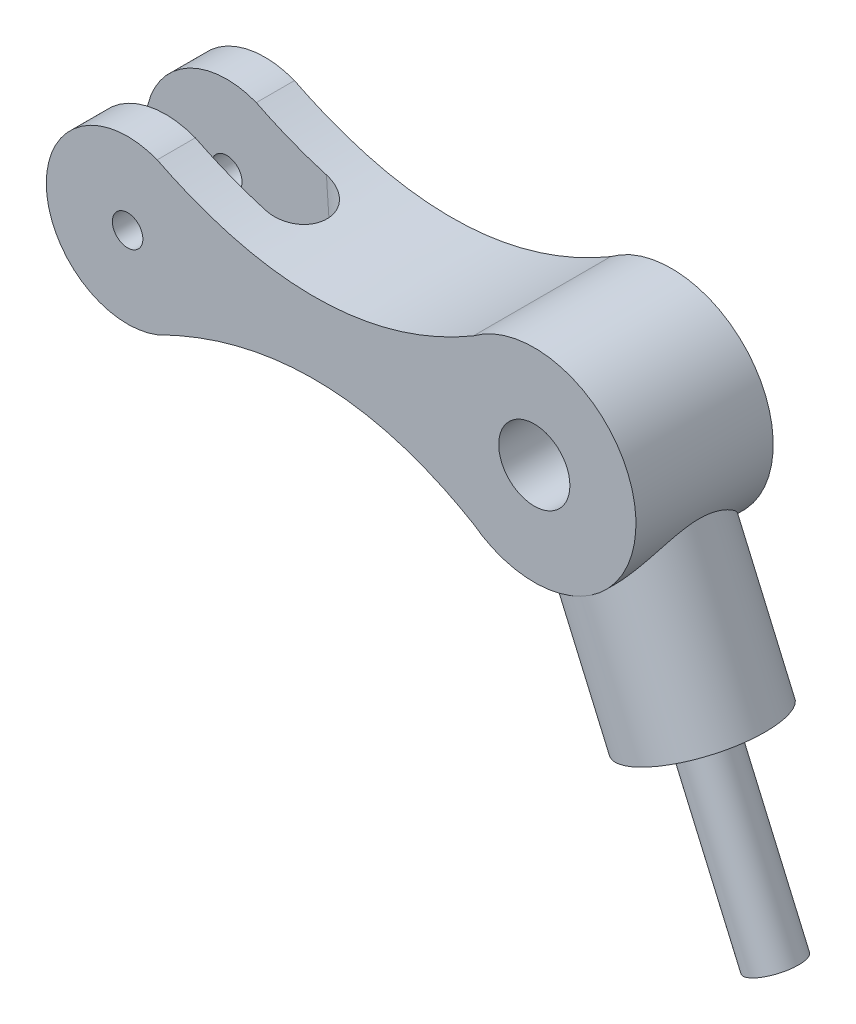
ISO-10303-21;
HEADER;
FILE_DESCRIPTION(('STEP AP214'),'2;1');
FILE_NAME('part.step','',(''),(''),'','','');
FILE_SCHEMA(('AUTOMOTIVE_DESIGN { 1 0 10303 214 1 1 1 1 }'));
ENDSEC;
DATA;
#1=APPLICATION_CONTEXT('core data for automotive mechanical design processes');
#2=APPLICATION_PROTOCOL_DEFINITION('international standard','automotive_design',2000,#1);
#3=PRODUCT_CONTEXT('',#1,'mechanical');
#4=PRODUCT('Part','Part','',(#3));
#5=PRODUCT_RELATED_PRODUCT_CATEGORY('part','',(#4));
#6=PRODUCT_DEFINITION_FORMATION('','',#4);
#7=PRODUCT_DEFINITION_CONTEXT('part definition',#1,'design');
#8=PRODUCT_DEFINITION('design','',#6,#7);
#9=PRODUCT_DEFINITION_SHAPE('','',#8);
#10=(LENGTH_UNIT() NAMED_UNIT(*) SI_UNIT(.MILLI.,.METRE.));
#11=(NAMED_UNIT(*) PLANE_ANGLE_UNIT() SI_UNIT($,.RADIAN.));
#12=(NAMED_UNIT(*) SI_UNIT($,.STERADIAN.) SOLID_ANGLE_UNIT());
#13=UNCERTAINTY_MEASURE_WITH_UNIT(LENGTH_MEASURE(1.E-05),#10,'distance_accuracy_value','');
#14=(GEOMETRIC_REPRESENTATION_CONTEXT(3) GLOBAL_UNCERTAINTY_ASSIGNED_CONTEXT((#13)) GLOBAL_UNIT_ASSIGNED_CONTEXT((#10,
#11,#12)) REPRESENTATION_CONTEXT('',''));
#15=CARTESIAN_POINT('',(0.,0.,0.));
#16=DIRECTION('',(0.,0.,1.));
#17=DIRECTION('',(1.,0.,0.));
#18=AXIS2_PLACEMENT_3D('',#15,#16,#17);
#19=CARTESIAN_POINT('',(55.942252811818,0.,13.5));
#20=DIRECTION('',(0.,0.,-1.));
#21=DIRECTION('',(-1.,0.,0.));
#22=AXIS2_PLACEMENT_3D('',#19,#20,#21);
#23=CYLINDRICAL_SURFACE('',#22,9.99999999999999);
#24=CARTESIAN_POINT('',(55.942252811818,0.,0.));
#25=DIRECTION('',(0.,0.,1.));
#26=DIRECTION('',(1.,0.,0.));
#27=AXIS2_PLACEMENT_3D('',#24,#25,#26);
#28=CIRCLE('',#27,9.99999999999999);
#29=CARTESIAN_POINT('',(49.9480196172884,-8.00432185819632,0.));
#30=VERTEX_POINT('',#29);
#31=CARTESIAN_POINT('',(60.5223949359773,-8.88944869620729,0.));
#32=VERTEX_POINT('',#31);
#33=EDGE_CURVE('E132',#30,#32,#28,.T.);
#34=ORIENTED_EDGE('',*,*,#33,.T.);
#35=CARTESIAN_POINT('',(65.4131906419706,-3.20956953770831,6.75));
#36=CARTESIAN_POINT('',(65.4131903282532,-3.20957446500106,6.59271011902694));
#37=CARTESIAN_POINT('',(65.4105628783188,-3.21735624223265,6.43534763654979));
#38=CARTESIAN_POINT('',(65.400051791324,-3.24812102991703,6.12221197366537));
#39=CARTESIAN_POINT('',(65.3921635656996,-3.27111731065455,5.96644030132915));
#40=CARTESIAN_POINT('',(65.371099119873,-3.33134675678611,5.657548712348));
#41=CARTESIAN_POINT('',(65.3579063469569,-3.36862446970872,5.50443867621186));
#42=CARTESIAN_POINT('',(65.3262162087858,-3.45591970728791,5.20239714961083));
#43=CARTESIAN_POINT('',(65.3077155761127,-3.50594507703394,5.05346829518884));
#44=CARTESIAN_POINT('',(65.265671405489,-3.61625364047853,4.762635548889));
#45=CARTESIAN_POINT('',(65.2422017006928,-3.67638424489065,4.62066270048013));
#46=CARTESIAN_POINT('',(65.1900183206903,-3.80574717731307,4.34201002160424));
#47=CARTESIAN_POINT('',(65.1613054749022,-3.87497806525494,4.20532935809975));
#48=CARTESIAN_POINT('',(65.0671620716154,-4.09403928196318,3.80358998121851));
#49=CARTESIAN_POINT('',(64.9936852813529,-4.25535379517104,3.54654400060154));
#50=CARTESIAN_POINT('',(64.8583635266996,-4.52947407140592,3.15390870789333));
#51=CARTESIAN_POINT('',(64.8037151243891,-4.63571399736818,3.011030623364));
#52=CARTESIAN_POINT('',(64.6860696717777,-4.85397225998646,2.73332059701513));
#53=CARTESIAN_POINT('',(64.6230713162144,-4.96599149838751,2.5984899179527));
#54=CARTESIAN_POINT('',(64.4208610531046,-5.30880848609888,2.20597845732678));
#55=CARTESIAN_POINT('',(64.2685072885842,-5.54621048707119,1.960494421241));
#56=CARTESIAN_POINT('',(63.9930083059543,-5.93448952995415,1.59373503558975));
#57=CARTESIAN_POINT('',(63.8814548919859,-6.08321112766533,1.46121450784275));
#58=CARTESIAN_POINT('',(63.6438573678277,-6.3813453324139,1.21047666661028));
#59=CARTESIAN_POINT('',(63.5178101050509,-6.5307580829765,1.0922624764461));
#60=CARTESIAN_POINT('',(63.2511951682608,-6.82782231323339,0.871654942528912));
#61=CARTESIAN_POINT('',(63.1106486814312,-6.97547602080363,0.769239044807763));
#62=CARTESIAN_POINT('',(62.8149543287501,-7.26698107861642,0.581554196208829));
#63=CARTESIAN_POINT('',(62.6598129159896,-7.41083407362825,0.496277719026028));
#64=CARTESIAN_POINT('',(62.3793167894563,-7.65433148239627,0.365009965339137));
#65=CARTESIAN_POINT('',(62.2572453883692,-7.75541546037791,0.31463033913639));
#66=CARTESIAN_POINT('',(62.0060059810937,-7.95339269838064,0.224485914566862));
#67=CARTESIAN_POINT('',(61.87683957148,-8.05028689252018,0.184718739806516));
#68=CARTESIAN_POINT('',(61.6120635924844,-8.23891068581037,0.116401722474417));
#69=CARTESIAN_POINT('',(61.4764584766241,-8.33064376154492,0.087844249514283));
#70=CARTESIAN_POINT('',(61.1994904542031,-8.50814334879939,0.0424012355333629));
#71=CARTESIAN_POINT('',(61.0581273797146,-8.5939096861047,0.0255160351867107));
#72=CARTESIAN_POINT('',(60.7701187225453,-8.75895824966189,0.00374437110009561));
#73=CARTESIAN_POINT('',(60.6234568302598,-8.83821746589292,-0.00110114873540141));
#74=CARTESIAN_POINT('',(60.3264351662197,-8.98925487067423,0.00152042063544576));
#75=CARTESIAN_POINT('',(60.1760754009931,-9.06103307242975,0.00898748810761847));
#76=CARTESIAN_POINT('',(59.8728785127879,-9.19661694420549,0.0362413508052443));
#77=CARTESIAN_POINT('',(59.7200410960682,-9.26042166099339,0.0560296173448663));
#78=CARTESIAN_POINT('',(59.4132002172768,-9.37974547614999,0.107743077669081));
#79=CARTESIAN_POINT('',(59.2591967802264,-9.43526475178771,0.139668011734875));
#80=CARTESIAN_POINT('',(58.9590806963103,-9.53532832630506,0.213395830223299));
#81=CARTESIAN_POINT('',(58.8129625013851,-9.58028540615935,0.254618137607315));
#82=CARTESIAN_POINT('',(58.5218466823896,-9.66274427033494,0.347279897009575));
#83=CARTESIAN_POINT('',(58.376849460399,-9.70024348893043,0.39872285310961));
#84=CARTESIAN_POINT('',(57.9451230491196,-9.8018201801972,0.567657565933605));
#85=CARTESIAN_POINT('',(57.6614197799755,-9.85505487699275,0.699814591645193));
#86=CARTESIAN_POINT('',(57.087109825858,-9.93883054094655,1.01091785849912));
#87=CARTESIAN_POINT('',(56.7977859841207,-9.96719960801004,1.19277428678029));
#88=CARTESIAN_POINT('',(56.2433433476607,-9.99932792491496,1.59225753438061));
#89=CARTESIAN_POINT('',(55.9782456773066,-10.0030658954592,1.80991511671498));
#90=CARTESIAN_POINT('',(55.4400245625894,-9.99153481126897,2.31260268901462));
#91=CARTESIAN_POINT('',(55.1718178829724,-9.97328703459612,2.60284471518994));
#92=CARTESIAN_POINT('',(54.6843041563913,-9.9235886003921,3.22095601133613));
#93=CARTESIAN_POINT('',(54.4649953071923,-9.89213842958678,3.5488238938502));
#94=CARTESIAN_POINT('',(54.1137382301529,-9.83278468747012,4.18788958321196));
#95=CARTESIAN_POINT('',(53.9737338231451,-9.80502806567744,4.49461159860274));
#96=CARTESIAN_POINT('',(53.8027906432307,-9.76862644736196,4.96883698024534));
#97=CARTESIAN_POINT('',(53.7523250508992,-9.75736616138665,5.12924267210825));
#98=CARTESIAN_POINT('',(53.6653200171419,-9.73743203665615,5.45391608240082));
#99=CARTESIAN_POINT('',(53.628774181792,-9.72875701078271,5.61818199076857));
#100=CARTESIAN_POINT('',(53.5702044468012,-9.7146438463433,5.95065055475984));
#101=CARTESIAN_POINT('',(53.5482868028933,-9.70922941912707,6.11887301884675));
#102=CARTESIAN_POINT('',(53.5199455098569,-9.7021979218121,6.45670678679136));
#103=CARTESIAN_POINT('',(53.5135217182146,-9.70058081678525,6.62631807786012));
#104=CARTESIAN_POINT('',(53.5163402265153,-9.7012859684183,6.96540758311274));
#105=CARTESIAN_POINT('',(53.5255832248931,-9.70360840070509,7.13488579102669));
#106=CARTESIAN_POINT('',(53.5594912501235,-9.71198998490728,7.47218481451308));
#107=CARTESIAN_POINT('',(53.5841557362555,-9.71804900580734,7.64000568798673));
#108=CARTESIAN_POINT('',(53.6449648355328,-9.73259119001785,7.95537394198968));
#109=CARTESIAN_POINT('',(53.6796543796358,-9.74075795806132,8.10321956288398));
#110=CARTESIAN_POINT('',(53.7603044323051,-9.75913957093228,8.3956921149014));
#111=CARTESIAN_POINT('',(53.8062686371497,-9.76935508721952,8.54031797346459));
#112=CARTESIAN_POINT('',(53.9600191120591,-9.80213092925187,8.96829496765182));
#113=CARTESIAN_POINT('',(54.0836923889043,-9.82682837856401,9.24589132876214));
#114=CARTESIAN_POINT('',(54.3848623567957,-9.87930205283791,9.81476421611703));
#115=CARTESIAN_POINT('',(54.5671271591126,-9.90708087436036,10.1034792046455));
#116=CARTESIAN_POINT('',(54.9703114317889,-9.95472358232926,10.6536664325884));
#117=CARTESIAN_POINT('',(55.1912681911116,-9.97457977234444,10.9151119999796));
#118=CARTESIAN_POINT('',(55.5694573424656,-9.99405169857428,11.3078184203211));
#119=CARTESIAN_POINT('',(55.7163344001963,-9.99860505432489,11.4489761570243));
#120=CARTESIAN_POINT('',(56.020370960258,-10.0008488156741,11.7197883951065));
#121=CARTESIAN_POINT('',(56.17752751542,-9.99854117998202,11.8494461686675));
#122=CARTESIAN_POINT('',(56.5008823050573,-9.98569551144501,12.0964075452126));
#123=CARTESIAN_POINT('',(56.667077961825,-9.97515981369016,12.2137146425509));
#124=CARTESIAN_POINT('',(57.0072482062699,-9.94459275573545,12.435049467855));
#125=CARTESIAN_POINT('',(57.1812210624003,-9.92456349977689,12.5390801320518));
#126=CARTESIAN_POINT('',(57.5060785120168,-9.87809348362382,12.7167275105692));
#127=CARTESIAN_POINT('',(57.6560041102109,-9.85326807413119,12.7925265506432));
#128=CARTESIAN_POINT('',(57.9592742879499,-9.79568442999783,12.9335052189485));
#129=CARTESIAN_POINT('',(58.1126182282058,-9.76292766754252,12.9986868141952));
#130=CARTESIAN_POINT('',(58.4215615293487,-9.68907815375326,13.1177682458821));
#131=CARTESIAN_POINT('',(58.5771594548792,-9.64799050810199,13.1716749513636));
#132=CARTESIAN_POINT('',(58.8894999705264,-9.55720563599993,13.267674405186));
#133=CARTESIAN_POINT('',(59.0462425733419,-9.50750831389524,13.3097670222583));
#134=CARTESIAN_POINT('',(59.3602439571733,-9.39920386801146,13.3818100156563));
#135=CARTESIAN_POINT('',(59.5175020465129,-9.34055921809179,13.4117072061178));
#136=CARTESIAN_POINT('',(59.8304810583036,-9.21466926037093,13.4587604710289));
#137=CARTESIAN_POINT('',(59.9862019781517,-9.14742393800865,13.4759165239073));
#138=CARTESIAN_POINT('',(60.2947239999563,-9.00471437240156,13.4973393569974));
#139=CARTESIAN_POINT('',(60.447525305899,-8.92925070583841,13.5016070409836));
#140=CARTESIAN_POINT('',(60.7489188221551,-8.77068718360534,13.4973154683948));
#141=CARTESIAN_POINT('',(60.8975112140828,-8.68758765808071,13.4887567661388));
#142=CARTESIAN_POINT('',(61.1789996090638,-8.52064213006124,13.4601302629508));
#143=CARTESIAN_POINT('',(61.31226242162,-8.43726471644197,13.4409193844447));
#144=CARTESIAN_POINT('',(61.5734171425013,-8.26525521122198,13.3919936833037));
#145=CARTESIAN_POINT('',(61.7013072103708,-8.1766213436753,13.362275293579));
#146=CARTESIAN_POINT('',(61.9510005013606,-7.99492261532203,13.2927951068871));
#147=CARTESIAN_POINT('',(62.0728053606516,-7.90185895886767,13.2530360272261));
#148=CARTESIAN_POINT('',(62.3099405927337,-7.71204473844573,13.1639729215775));
#149=CARTESIAN_POINT('',(62.425268430233,-7.61529275529735,13.1146651911062));
#150=CARTESIAN_POINT('',(62.6560414475452,-7.41282893627145,13.0037150661454));
#151=CARTESIAN_POINT('',(62.7710492888631,-7.30693378175519,12.9414968949251));
#152=CARTESIAN_POINT('',(62.9931537438004,-7.09285787866868,12.8075776618063));
#153=CARTESIAN_POINT('',(63.1002476208352,-6.98467635596636,12.7358733433686));
#154=CARTESIAN_POINT('',(63.4095449906225,-6.65802313648727,12.507434101812));
#155=CARTESIAN_POINT('',(63.5998536018982,-6.43736317744097,12.3373290848344));
#156=CARTESIAN_POINT('',(63.8765621124356,-6.08883489708679,12.0430708579551));
#157=CARTESIAN_POINT('',(63.9733702075149,-5.96035745904392,11.9290345509014));
#158=CARTESIAN_POINT('',(64.1565418940759,-5.70526590110043,11.6909053200788));
#159=CARTESIAN_POINT('',(64.2429069921066,-5.57865151474875,11.5668138512326));
#160=CARTESIAN_POINT('',(64.4056301207998,-5.32855932499476,11.3089152977654));
#161=CARTESIAN_POINT('',(64.4819750407249,-5.20508579808834,11.1750958333294));
#162=CARTESIAN_POINT('',(64.6249010105613,-4.96299941316684,10.8982462105959));
#163=CARTESIAN_POINT('',(64.691485263455,-4.84438496988165,10.7552190960799));
#164=CARTESIAN_POINT('',(64.8126813098777,-4.61857325889817,10.4663461379211));
#165=CARTESIAN_POINT('',(64.8676799225338,-4.51110538499484,10.3208743217992));
#166=CARTESIAN_POINT('',(64.9694120064075,-4.30391843550718,10.0216979365494));
#167=CARTESIAN_POINT('',(65.0161445864332,-4.20420019608891,9.86799248204678));
#168=CARTESIAN_POINT('',(65.1015458291601,-4.01473966015517,9.55268390873715));
#169=CARTESIAN_POINT('',(65.1402255722733,-3.92498373637029,9.39109202464197));
#170=CARTESIAN_POINT('',(65.209818560403,-3.75771680281769,9.06000117876033));
#171=CARTESIAN_POINT('',(65.2407315462874,-3.68020620163792,8.89050195337504));
#172=CARTESIAN_POINT('',(65.2878619932331,-3.55846522152859,8.58932803844416));
#173=CARTESIAN_POINT('',(65.3058099811929,-3.5108247009712,8.45929853008749));
#174=CARTESIAN_POINT('',(65.3375604305756,-3.42495152554431,8.19568768579335));
#175=CARTESIAN_POINT('',(65.3513641455263,-3.38671602655009,8.06210743719051));
#176=CARTESIAN_POINT('',(65.3748109924465,-3.32085357059488,7.79239128257619));
#177=CARTESIAN_POINT('',(65.3844658291592,-3.29319679370914,7.65626371205498));
#178=CARTESIAN_POINT('',(65.3996678899122,-3.24928422408865,7.38200548128885));
#179=CARTESIAN_POINT('',(65.4052177924522,-3.23302099734557,7.24387618729153));
#180=CARTESIAN_POINT('',(65.4102074005869,-3.21836165323251,7.04619622527894));
#181=CARTESIAN_POINT('',(65.4113259112392,-3.21506781425389,6.9870171989215));
#182=CARTESIAN_POINT('',(65.4128176375095,-3.21067069134667,6.86856222734911));
#183=CARTESIAN_POINT('',(65.4131907602181,-3.2095676804953,6.80928627097371));
#184=CARTESIAN_POINT('',(65.4131906419706,-3.20956953770831,6.75));
#185=B_SPLINE_CURVE_WITH_KNOTS('',3,(#35,#36,#37,#38,#39,#40,#41,#42,#43,#44,#45,#46,#47,#48,
#49,#50,#51,#52,#53,#54,#55,#56,#57,#58,#59,#60,#61,#62,#63,#64,#65,#66,#67,#68,#69,#70,#71,#72,
#73,#74,#75,#76,#77,#78,#79,#80,#81,#82,#83,#84,#85,#86,#87,#88,#89,#90,#91,#92,#93,#94,#95,#96,
#97,#98,#99,#100,#101,#102,#103,#104,#105,#106,#107,#108,#109,#110,#111,#112,#113,#114,#115,
#116,#117,#118,#119,#120,#121,#122,#123,#124,#125,#126,#127,#128,#129,#130,#131,#132,#133,#134,
#135,#136,#137,#138,#139,#140,#141,#142,#143,#144,#145,#146,#147,#148,#149,#150,#151,#152,#153,
#154,#155,#156,#157,#158,#159,#160,#161,#162,#163,#164,#165,#166,#167,#168,#169,#170,#171,#172,
#173,#174,#175,#176,#177,#178,#179,#180,#181,#182,#183,#184),.UNSPECIFIED.,.T.,.F.,(4,2,2,2,2,2,
2,2,2,2,2,2,2,2,2,2,2,2,2,2,2,2,2,2,2,2,2,2,2,2,2,2,2,2,2,2,2,2,2,2,2,2,2,2,2,2,2,2,2,2,2,2,2,2,
2,2,2,2,2,2,2,2,2,2,2,2,2,2,2,2,2,2,2,2,4),(0.,0.471786685103131,0.943985412040329,
1.41766920340758,1.89164521352252,2.35901911894529,2.82631915392471,3.75998313218948,
4.31834542677098,4.8767951075606,5.99451563681231,6.67870157332916,7.3630366110549,
8.04638545134887,8.7294335590151,9.22785753243807,9.72616980242539,10.2241422830605,
10.7221292972134,11.2218075353302,11.7214848914163,12.2212219270353,12.720948269126,
13.1954260749439,13.6700668339223,14.6185809436939,15.6434528880532,16.6692101238418,
17.8510500935808,19.0328464968609,20.0432895025483,20.548351223233,21.0531806674431,
21.5616382832961,22.0700912222925,22.5785668290169,23.0870246081664,23.5427753654307,
23.9986757359309,24.9100344586334,25.9342289621788,26.9594160099279,27.5701035433599,
28.1806167514771,28.790956761396,29.4011615530464,29.910113708085,30.4189714658209,
30.9275183014609,31.4360707874414,31.9468180175158,32.457566112305,32.9682783909368,
33.4789685987076,33.9535349990858,34.4282626601824,34.9028619834235,35.3776458018868,
35.881909485092,36.3863467304779,37.3948423356034,37.9859735026532,38.5770192887246,
39.1688308689815,39.7604478082428,40.3270838652013,40.8937809761266,41.4596931022705,
42.0256241071391,42.4441725485221,42.8625942627619,43.279827657013,43.6967885626581,
43.8745939455395,44.0524214897005),.UNSPECIFIED.);
#186=CARTESIAN_POINT('',(60.5223949359773,-8.88944869620728,13.5));
#187=VERTEX_POINT('',#186);
#188=EDGE_CURVE('E11',#32,#187,#185,.T.);
#189=ORIENTED_EDGE('',*,*,#188,.T.);
#190=CARTESIAN_POINT('',(55.942252811818,0.,13.5));
#191=DIRECTION('',(0.,0.,1.));
#192=DIRECTION('',(1.,0.,0.));
#193=AXIS2_PLACEMENT_3D('',#190,#191,#192);
#194=CIRCLE('',#193,9.99999999999999);
#195=CARTESIAN_POINT('',(49.9480196172884,-8.00432185819632,13.5));
#196=VERTEX_POINT('',#195);
#197=EDGE_CURVE('E130',#196,#187,#194,.T.);
#198=ORIENTED_EDGE('',*,*,#197,.F.);
#199=DIRECTION('',(0.,0.,-1.));
#200=VECTOR('',#199,1.);
#201=CARTESIAN_POINT('',(49.9480196172884,-8.00432185819632,13.5));
#202=LINE('',#201,#200);
#203=EDGE_CURVE('E150',#196,#30,#202,.T.);
#204=ORIENTED_EDGE('',*,*,#203,.T.);
#205=EDGE_LOOP('',(#34,#189,#198,#204));
#206=FACE_BOUND('',#205,.T.);
#207=ADVANCED_FACE('F45',(#206),#23,.T.);
#208=CARTESIAN_POINT('',(15.942252811818,0.,13.5));
#209=DIRECTION('',(0.,0.,-1.));
#210=DIRECTION('',(-1.,0.,0.));
#211=AXIS2_PLACEMENT_3D('',#208,#209,#210);
#212=CYLINDRICAL_SURFACE('',#211,8.);
#213=CARTESIAN_POINT('',(15.942252811818,0.,9.75));
#214=DIRECTION('',(0.,0.,1.));
#215=DIRECTION('',(1.,0.,0.));
#216=AXIS2_PLACEMENT_3D('',#213,#214,#215);
#217=CIRCLE('',#216,8.);
#218=CARTESIAN_POINT('',(18.8511539796969,7.45240189439034,9.75));
#219=VERTEX_POINT('',#218);
#220=CARTESIAN_POINT('',(18.8511539796969,-7.45240189439035,9.75));
#221=VERTEX_POINT('',#220);
#222=EDGE_CURVE('E271',#219,#221,#217,.T.);
#223=ORIENTED_EDGE('',*,*,#222,.T.);
#224=DIRECTION('',(0.,0.,-1.));
#225=VECTOR('',#224,1.);
#226=CARTESIAN_POINT('',(18.8511539796969,-7.45240189439035,13.5));
#227=LINE('',#226,#225);
#228=CARTESIAN_POINT('',(18.8511539796969,-7.45240189439035,13.5));
#229=VERTEX_POINT('',#228);
#230=EDGE_CURVE('E187',#229,#221,#227,.T.);
#231=ORIENTED_EDGE('',*,*,#230,.F.);
#232=CARTESIAN_POINT('',(15.942252811818,0.,13.5));
#233=DIRECTION('',(0.,0.,1.));
#234=DIRECTION('',(1.,0.,0.));
#235=AXIS2_PLACEMENT_3D('',#232,#233,#234);
#236=CIRCLE('',#235,8.);
#237=CARTESIAN_POINT('',(18.8511539796969,7.45240189439034,13.5));
#238=VERTEX_POINT('',#237);
#239=EDGE_CURVE('E261',#238,#229,#236,.T.);
#240=ORIENTED_EDGE('',*,*,#239,.F.);
#241=DIRECTION('',(0.,0.,-1.));
#242=VECTOR('',#241,1.);
#243=CARTESIAN_POINT('',(18.8511539796969,7.45240189439034,13.5));
#244=LINE('',#243,#242);
#245=EDGE_CURVE('E192',#238,#219,#244,.T.);
#246=ORIENTED_EDGE('',*,*,#245,.T.);
#247=EDGE_LOOP('',(#223,#231,#240,#246));
#248=FACE_BOUND('',#247,.T.);
#249=ADVANCED_FACE('F270',(#248),#212,.T.);
#250=CARTESIAN_POINT('',(15.942252811818,0.,13.5));
#251=DIRECTION('',(0.,0.,-1.));
#252=DIRECTION('',(-1.,0.,0.));
#253=AXIS2_PLACEMENT_3D('',#250,#251,#252);
#254=CYLINDRICAL_SURFACE('',#253,1.5);
#255=CARTESIAN_POINT('',(15.942252811818,0.,9.75));
#256=DIRECTION('',(0.,0.,1.));
#257=DIRECTION('',(1.,0.,0.));
#258=AXIS2_PLACEMENT_3D('',#255,#256,#257);
#259=CIRCLE('',#258,1.5);
#260=CARTESIAN_POINT('',(17.442252811818,0.,9.75));
#261=VERTEX_POINT('',#260);
#262=EDGE_CURVE('E202',#261,#261,#259,.T.);
#263=ORIENTED_EDGE('',*,*,#262,.F.);
#264=EDGE_LOOP('',(#263));
#265=FACE_BOUND('',#264,.T.);
#266=CARTESIAN_POINT('',(15.942252811818,0.,13.5));
#267=DIRECTION('',(0.,0.,1.));
#268=DIRECTION('',(1.,0.,0.));
#269=AXIS2_PLACEMENT_3D('',#266,#267,#268);
#270=CIRCLE('',#269,1.5);
#271=CARTESIAN_POINT('',(17.442252811818,0.,13.5));
#272=VERTEX_POINT('',#271);
#273=EDGE_CURVE('E244',#272,#272,#270,.T.);
#274=ORIENTED_EDGE('',*,*,#273,.T.);
#275=EDGE_LOOP('',(#274));
#276=FACE_BOUND('',#275,.T.);
#277=ADVANCED_FACE('F350',(#265,#276),#254,.F.);
#278=CARTESIAN_POINT('',(34.7872774331445,3.51418563633678,13.5));
#279=DIRECTION('',(0.,0.,1.));
#280=DIRECTION('',(1.,0.,0.));
#281=AXIS2_PLACEMENT_3D('',#278,#279,#280);
#282=PLANE('',#281);
#283=ORIENTED_EDGE('',*,*,#197,.T.);
#284=CARTESIAN_POINT('',(49.9480196172884,8.00432185819633,13.5));
#285=VERTEX_POINT('',#284);
#286=EDGE_CURVE('E134',#187,#285,#194,.T.);
#287=ORIENTED_EDGE('',*,*,#286,.T.);
#288=CARTESIAN_POINT('',(49.9480196172884,8.00432185819632,13.5));
#289=CARTESIAN_POINT('',(35.1749680677963,-0.699990603619766,13.5));
#290=CARTESIAN_POINT('',(18.8511539796969,7.45240189439034,13.5));
#291=B_SPLINE_CURVE_WITH_KNOTS('',2,(#288,#289,#290),.UNSPECIFIED.,.F.,.F.,(3,3),(0.,1.),.UNSPECIFIED.);
#292=EDGE_CURVE('E182',#285,#238,#291,.T.);
#293=ORIENTED_EDGE('',*,*,#292,.T.);
#294=ORIENTED_EDGE('',*,*,#239,.T.);
#295=CARTESIAN_POINT('',(18.8511539796969,-7.45240189439035,13.5));
#296=CARTESIAN_POINT('',(35.1749680677963,0.699990603619759,13.5));
#297=CARTESIAN_POINT('',(49.9480196172884,-8.00432185819632,13.5));
#298=B_SPLINE_CURVE_WITH_KNOTS('',2,(#295,#296,#297),.UNSPECIFIED.,.F.,.F.,(3,3),(0.,1.),.UNSPECIFIED.);
#299=EDGE_CURVE('E142',#229,#196,#298,.T.);
#300=ORIENTED_EDGE('',*,*,#299,.T.);
#301=EDGE_LOOP('',(#283,#287,#293,#294,#300));
#302=FACE_BOUND('',#301,.T.);
#303=CARTESIAN_POINT('',(55.942252811818,0.,13.5));
#304=DIRECTION('',(0.,0.,1.));
#305=DIRECTION('',(1.,0.,0.));
#306=AXIS2_PLACEMENT_3D('',#303,#304,#305);
#307=CIRCLE('',#306,3.5);
#308=CARTESIAN_POINT('',(59.442252811818,0.,13.5));
#309=VERTEX_POINT('',#308);
#310=EDGE_CURVE('E165',#309,#309,#307,.T.);
#311=ORIENTED_EDGE('',*,*,#310,.F.);
#312=EDGE_LOOP('',(#311));
#313=FACE_BOUND('',#312,.T.);
#314=ORIENTED_EDGE('',*,*,#273,.F.);
#315=EDGE_LOOP('',(#314));
#316=FACE_BOUND('',#315,.T.);
#317=ADVANCED_FACE('F144',(#302,#313,#316),#282,.T.);
#318=CARTESIAN_POINT('',(34.7872774331445,3.51418563633678,0.));
#319=DIRECTION('',(0.,0.,1.));
#320=DIRECTION('',(1.,0.,0.));
#321=AXIS2_PLACEMENT_3D('',#318,#319,#320);
#322=PLANE('',#321);
#323=CARTESIAN_POINT('',(49.9480196172884,8.00432185819633,0.));
#324=VERTEX_POINT('',#323);
#325=EDGE_CURVE('E177',#32,#324,#28,.T.);
#326=ORIENTED_EDGE('',*,*,#325,.F.);
#327=ORIENTED_EDGE('',*,*,#33,.F.);
#328=CARTESIAN_POINT('',(18.8511539796969,-7.45240189439035,0.));
#329=CARTESIAN_POINT('',(35.1749680677963,0.699990603619759,0.));
#330=CARTESIAN_POINT('',(49.9480196172884,-8.00432185819632,0.));
#331=B_SPLINE_CURVE_WITH_KNOTS('',2,(#328,#329,#330),.UNSPECIFIED.,.F.,.F.,(3,3),(0.,1.),.UNSPECIFIED.);
#332=CARTESIAN_POINT('',(18.8511539796969,-7.45240189439035,0.));
#333=VERTEX_POINT('',#332);
#334=EDGE_CURVE('E172',#333,#30,#331,.T.);
#335=ORIENTED_EDGE('',*,*,#334,.F.);
#336=CARTESIAN_POINT('',(15.942252811818,0.,0.));
#337=DIRECTION('',(0.,0.,1.));
#338=DIRECTION('',(1.,0.,0.));
#339=AXIS2_PLACEMENT_3D('',#336,#337,#338);
#340=CIRCLE('',#339,8.);
#341=CARTESIAN_POINT('',(18.8511539796969,7.45240189439034,0.));
#342=VERTEX_POINT('',#341);
#343=EDGE_CURVE('E164',#342,#333,#340,.T.);
#344=ORIENTED_EDGE('',*,*,#343,.F.);
#345=CARTESIAN_POINT('',(49.9480196172884,8.00432185819632,0.));
#346=CARTESIAN_POINT('',(35.1749680677963,-0.699990603619766,0.));
#347=CARTESIAN_POINT('',(18.8511539796969,7.45240189439034,0.));
#348=B_SPLINE_CURVE_WITH_KNOTS('',2,(#345,#346,#347),.UNSPECIFIED.,.F.,.F.,(3,3),(0.,1.),.UNSPECIFIED.);
#349=EDGE_CURVE('E158',#324,#342,#348,.T.);
#350=ORIENTED_EDGE('',*,*,#349,.F.);
#351=EDGE_LOOP('',(#326,#327,#335,#344,#350));
#352=FACE_BOUND('',#351,.T.);
#353=CARTESIAN_POINT('',(55.942252811818,0.,0.));
#354=DIRECTION('',(0.,0.,1.));
#355=DIRECTION('',(1.,0.,0.));
#356=AXIS2_PLACEMENT_3D('',#353,#354,#355);
#357=CIRCLE('',#356,3.5);
#358=CARTESIAN_POINT('',(59.442252811818,0.,0.));
#359=VERTEX_POINT('',#358);
#360=EDGE_CURVE('E248',#359,#359,#357,.T.);
#361=ORIENTED_EDGE('',*,*,#360,.T.);
#362=EDGE_LOOP('',(#361));
#363=FACE_BOUND('',#362,.T.);
#364=CARTESIAN_POINT('',(15.942252811818,0.,0.));
#365=DIRECTION('',(0.,0.,1.));
#366=DIRECTION('',(1.,0.,0.));
#367=AXIS2_PLACEMENT_3D('',#364,#365,#366);
#368=CIRCLE('',#367,1.5);
#369=CARTESIAN_POINT('',(17.442252811818,0.,0.));
#370=VERTEX_POINT('',#369);
#371=EDGE_CURVE('E239',#370,#370,#368,.T.);
#372=ORIENTED_EDGE('',*,*,#371,.T.);
#373=EDGE_LOOP('',(#372));
#374=FACE_BOUND('',#373,.T.);
#375=ADVANCED_FACE('F277',(#352,#363,#374),#322,.F.);
#376=DIRECTION('',(0.,0.,-1.));
#377=VECTOR('',#376,1.);
#378=SURFACE_OF_LINEAR_EXTRUSION('',#291,#377);
#379=CARTESIAN_POINT('',(25.745514881789,4.74118365832504,3.75));
#380=CARTESIAN_POINT('',(25.8338126865135,4.71602493625938,3.74999451411827));
#381=CARTESIAN_POINT('',(25.9222140827867,4.69121905384552,3.75372814286331));
#382=CARTESIAN_POINT('',(26.0986342565005,4.64246202208675,3.76869704294322));
#383=CARTESIAN_POINT('',(26.1866529558314,4.61851104064325,3.77993377943118));
#384=CARTESIAN_POINT('',(26.3618128119497,4.57158802902757,3.80995458250895));
#385=CARTESIAN_POINT('',(26.4489524729529,4.54861750406213,3.82874982242122));
#386=CARTESIAN_POINT('',(26.6215424291751,4.50383720066943,3.87383288804662));
#387=CARTESIAN_POINT('',(26.7069928476362,4.48202733736572,3.90012016498885));
#388=CARTESIAN_POINT('',(26.9601398207123,4.41844778396927,3.99024065876419));
#389=CARTESIAN_POINT('',(27.1244861420892,4.37856707864861,4.06530776527469));
#390=CARTESIAN_POINT('',(27.438205148596,4.30475920710172,4.24376889761719));
#391=CARTESIAN_POINT('',(27.5875924573991,4.27082620165987,4.34713488233058));
#392=CARTESIAN_POINT('',(27.8607695707859,4.21052683269265,4.57505261955433));
#393=CARTESIAN_POINT('',(27.9853392047975,4.18391388958538,4.69860240023669));
#394=CARTESIAN_POINT('',(28.2115635491309,4.1367286592038,4.96620719368651));
#395=CARTESIAN_POINT('',(28.3132172251601,4.11615664456903,5.11026313150355));
#396=CARTESIAN_POINT('',(28.485990771612,4.08183935095829,5.40795055481163));
#397=CARTESIAN_POINT('',(28.558244436236,4.06783651756119,5.56089502402591));
#398=CARTESIAN_POINT('',(28.675816207828,4.04531745713382,5.87717037962523));
#399=CARTESIAN_POINT('',(28.7211410508011,4.03679985797624,6.0404986572675));
#400=CARTESIAN_POINT('',(28.7824962379741,4.02532189807185,6.36848953342401));
#401=CARTESIAN_POINT('',(28.7992342105922,4.02222724754059,6.53301542724931));
#402=CARTESIAN_POINT('',(28.8050567177149,4.02114749794988,6.86257163224893));
#403=CARTESIAN_POINT('',(28.794142563702,4.02316215656662,7.02760191913018));
#404=CARTESIAN_POINT('',(28.7452394986869,4.03228290093608,7.35201446126244));
#405=CARTESIAN_POINT('',(28.7074806356413,4.03934572871568,7.51143270982656));
#406=CARTESIAN_POINT('',(28.606390383501,4.05857493150634,7.8216068883139));
#407=CARTESIAN_POINT('',(28.5430592119499,4.07074126310195,7.97236289191436));
#408=CARTESIAN_POINT('',(28.3924630403887,4.10032437937592,8.26192382174175));
#409=CARTESIAN_POINT('',(28.3050646368726,4.11777048457142,8.40065629478937));
#410=CARTESIAN_POINT('',(28.1093175222112,4.15790020021294,8.66157014431935));
#411=CARTESIAN_POINT('',(28.0009682951139,4.18058393964787,8.78375111306492));
#412=CARTESIAN_POINT('',(27.7642767691403,4.23161573165373,9.01092542423425));
#413=CARTESIAN_POINT('',(27.6355692302172,4.26007064865646,9.11551376554384));
#414=CARTESIAN_POINT('',(27.3637587120819,4.32208439598197,9.30207555267527));
#415=CARTESIAN_POINT('',(27.2206499691104,4.35564527262339,9.38403989423168));
#416=CARTESIAN_POINT('',(26.9185851566914,4.42876111005561,9.52644428537353));
#417=CARTESIAN_POINT('',(26.7592341278311,4.46849497638408,9.58595133684124));
#418=CARTESIAN_POINT('',(26.434112858739,4.55220685289305,9.67802427507085));
#419=CARTESIAN_POINT('',(26.2683487924313,4.59618083907191,9.71061543020488));
#420=CARTESIAN_POINT('',(26.0424028191607,4.65796154904554,9.73648326693394));
#421=CARTESIAN_POINT('',(25.9830068267466,4.67437321890555,9.74156093968052));
#422=CARTESIAN_POINT('',(25.8642379315566,4.70753053827799,9.74831453922416));
#423=CARTESIAN_POINT('',(25.8048652040175,4.72427548486609,9.7499969887359));
#424=CARTESIAN_POINT('',(25.745514881789,4.74118365832504,9.75));
#425=B_SPLINE_CURVE_WITH_KNOTS('',3,(#379,#380,#381,#382,#383,#384,#385,#386,#387,#388,#389,
#390,#391,#392,#393,#394,#395,#396,#397,#398,#399,#400,#401,#402,#403,#404,#405,#406,#407,#408,
#409,#410,#411,#412,#413,#414,#415,#416,#417,#418,#419,#420,#421,#422,#423,#424),.UNSPECIFIED.,
.F.,.F.,(4,2,2,2,2,2,2,2,2,2,2,2,2,2,2,2,2,2,2,2,2,2,4),(0.,0.275362703227423,0.55077919304057,
0.826604321413347,1.10240925155179,1.65447244722403,2.205990575807,2.73565129460696,
3.26533591441307,3.77202983467589,4.27859695654144,4.77243252657293,5.26624467545768,
5.7558752902203,6.2455017397838,6.73789877676724,7.2303079414643,7.73284050564071,
8.23557500323865,8.75735394940762,9.27864249614725,9.46406431173101,9.64912956477714),.UNSPECIFIED.);
#426=CARTESIAN_POINT('',(25.7455148818123,4.74118365798976,3.75));
#427=VERTEX_POINT('',#426);
#428=CARTESIAN_POINT('',(25.7455148818123,4.74118365798976,9.75));
#429=VERTEX_POINT('',#428);
#430=EDGE_CURVE('E230',#427,#429,#425,.T.);
#431=ORIENTED_EDGE('',*,*,#430,.T.);
#432=CARTESIAN_POINT('',(49.9480196172884,8.00432185819632,9.75));
#433=CARTESIAN_POINT('',(35.1749680677963,-0.699990603619766,9.75));
#434=CARTESIAN_POINT('',(18.8511539796969,7.45240189439034,9.75));
#435=B_SPLINE_CURVE_WITH_KNOTS('',2,(#432,#433,#434),.UNSPECIFIED.,.F.,.F.,(3,3),(0.,1.),.UNSPECIFIED.);
#436=EDGE_CURVE('E240',#429,#219,#435,.T.);
#437=ORIENTED_EDGE('',*,*,#436,.T.);
#438=ORIENTED_EDGE('',*,*,#245,.F.);
#439=ORIENTED_EDGE('',*,*,#292,.F.);
#440=DIRECTION('',(0.,0.,-1.));
#441=VECTOR('',#440,1.);
#442=CARTESIAN_POINT('',(49.9480196172884,8.00432185819633,13.5));
#443=LINE('',#442,#441);
#444=EDGE_CURVE('E137',#285,#324,#443,.T.);
#445=ORIENTED_EDGE('',*,*,#444,.T.);
#446=ORIENTED_EDGE('',*,*,#349,.T.);
#447=CARTESIAN_POINT('',(18.8511539796969,7.45240189439034,3.75));
#448=VERTEX_POINT('',#447);
#449=EDGE_CURVE('E191',#448,#342,#244,.T.);
#450=ORIENTED_EDGE('',*,*,#449,.F.);
#451=CARTESIAN_POINT('',(49.9480196172884,8.00432185819632,3.75));
#452=CARTESIAN_POINT('',(35.1749680677963,-0.699990603619766,3.75));
#453=CARTESIAN_POINT('',(18.8511539796969,7.45240189439034,3.75));
#454=B_SPLINE_CURVE_WITH_KNOTS('',2,(#451,#452,#453),.UNSPECIFIED.,.F.,.F.,(3,3),(0.,1.),.UNSPECIFIED.);
#455=EDGE_CURVE('E206',#448,#427,#454,.F.);
#456=ORIENTED_EDGE('',*,*,#455,.T.);
#457=EDGE_LOOP('',(#431,#437,#438,#439,#445,#446,#450,#456));
#458=FACE_BOUND('',#457,.T.);
#459=ADVANCED_FACE('F47',(#458),#378,.F.);
#460=CARTESIAN_POINT('',(18.8511539796969,-7.45240189439035,3.75));
#461=VERTEX_POINT('',#460);
#462=EDGE_CURVE('E186',#461,#333,#227,.T.);
#463=ORIENTED_EDGE('',*,*,#462,.F.);
#464=CARTESIAN_POINT('',(15.942252811818,0.,3.75));
#465=DIRECTION('',(0.,0.,-1.));
#466=DIRECTION('',(-1.,0.,0.));
#467=AXIS2_PLACEMENT_3D('',#464,#465,#466);
#468=CIRCLE('',#467,8.);
#469=EDGE_CURVE('E73',#461,#448,#468,.T.);
#470=ORIENTED_EDGE('',*,*,#469,.T.);
#471=ORIENTED_EDGE('',*,*,#449,.T.);
#472=ORIENTED_EDGE('',*,*,#343,.T.);
#473=EDGE_LOOP('',(#463,#470,#471,#472));
#474=FACE_BOUND('',#473,.T.);
#475=ADVANCED_FACE('F351',(#474),#212,.T.);
#476=DIRECTION('',(0.,0.,-1.));
#477=VECTOR('',#476,1.);
#478=SURFACE_OF_LINEAR_EXTRUSION('',#298,#477);
#479=ORIENTED_EDGE('',*,*,#230,.T.);
#480=CARTESIAN_POINT('',(18.8511539796969,-7.45240189439035,9.75));
#481=CARTESIAN_POINT('',(35.1749680677963,0.699990603619759,9.75));
#482=CARTESIAN_POINT('',(49.9480196172884,-8.00432185819632,9.75));
#483=B_SPLINE_CURVE_WITH_KNOTS('',2,(#480,#481,#482),.UNSPECIFIED.,.F.,.F.,(3,3),(0.,1.),.UNSPECIFIED.);
#484=CARTESIAN_POINT('',(26.3906682083042,-4.56407711746352,9.75));
#485=VERTEX_POINT('',#484);
#486=EDGE_CURVE('E205',#221,#485,#483,.T.);
#487=ORIENTED_EDGE('',*,*,#486,.T.);
#488=CARTESIAN_POINT('',(26.3906682081751,-4.56407711560261,9.75));
#489=CARTESIAN_POINT('',(26.4737134360535,-4.54213938717111,9.75000753077723));
#490=CARTESIAN_POINT('',(26.5568418623915,-4.52052002452286,9.74644129737664));
#491=CARTESIAN_POINT('',(26.722687725428,-4.47805232031444,9.73218744982151));
#492=CARTESIAN_POINT('',(26.8054051437305,-4.45720401300068,9.72149951975668));
#493=CARTESIAN_POINT('',(26.9698350887425,-4.41641692280551,9.69302999640984));
#494=CARTESIAN_POINT('',(27.0515477249899,-4.39647804012795,9.67524918356572));
#495=CARTESIAN_POINT('',(27.2133552247069,-4.35762716528954,9.63270312153766));
#496=CARTESIAN_POINT('',(27.2934501484447,-4.3387151348286,9.60793813306704));
#497=CARTESIAN_POINT('',(27.5305804326125,-4.28363430391425,9.52328825799882));
#498=CARTESIAN_POINT('',(27.6844541897733,-4.24912252203068,9.45304969360908));
#499=CARTESIAN_POINT('',(27.9786263302806,-4.18519326915412,9.28689763680046));
#500=CARTESIAN_POINT('',(28.1189306197326,-4.15577357738794,9.19099538358289));
#501=CARTESIAN_POINT('',(28.3802546560615,-4.1025712199179,8.97739198001587));
#502=CARTESIAN_POINT('',(28.5014817665984,-4.07872633728073,8.85996041943594));
#503=CARTESIAN_POINT('',(28.7229003033328,-4.0362821098472,8.60585206207425));
#504=CARTESIAN_POINT('',(28.8230882941871,-4.01768362153104,8.46917212842634));
#505=CARTESIAN_POINT('',(28.998560841584,-3.98577796168938,8.18176960985466));
#506=CARTESIAN_POINT('',(29.0740551121108,-3.97242602672105,8.03117999333788));
#507=CARTESIAN_POINT('',(29.1990532772228,-3.95062934614607,7.71925716601304));
#508=CARTESIAN_POINT('',(29.2485595986585,-3.94218414232288,7.55792495997371));
#509=CARTESIAN_POINT('',(29.320018502207,-3.93007325436315,7.22951362324595));
#510=CARTESIAN_POINT('',(29.3420383350917,-3.92639590393548,7.0624495507992));
#511=CARTESIAN_POINT('',(29.3580921238337,-3.92371007701019,6.72694059993145));
#512=CARTESIAN_POINT('',(29.3521254566218,-3.92470170445899,6.55849569085195));
#513=CARTESIAN_POINT('',(29.3123883226018,-3.93137325623919,6.22506625042342));
#514=CARTESIAN_POINT('',(29.2786265093699,-3.93705172139968,6.06008065846294));
#515=CARTESIAN_POINT('',(29.1843163710649,-3.95320069026865,5.73820004956081));
#516=CARTESIAN_POINT('',(29.1237683006697,-3.96367114841591,5.58130495571226));
#517=CARTESIAN_POINT('',(28.9776871233026,-3.98955900684459,5.2800351434521));
#518=CARTESIAN_POINT('',(28.89215129236,-4.00497694647985,5.13566179228956));
#519=CARTESIAN_POINT('',(28.6986664117356,-4.04089753378309,4.86353522611999));
#520=CARTESIAN_POINT('',(28.5907184761164,-4.06139992872242,4.73578118551221));
#521=CARTESIAN_POINT('',(28.3555095730243,-4.10756360286307,4.50030546699267));
#522=CARTESIAN_POINT('',(28.2282263793365,-4.13323083029641,4.39260716477875));
#523=CARTESIAN_POINT('',(27.958194856844,-4.18959874962322,4.20032273860602));
#524=CARTESIAN_POINT('',(27.815442061613,-4.22030089653302,4.11574331455456));
#525=CARTESIAN_POINT('',(27.5177911282575,-4.28658340083224,3.97146232521161));
#526=CARTESIAN_POINT('',(27.3628215294214,-4.32219353767755,3.91192238074922));
#527=CARTESIAN_POINT('',(27.0461076485076,-4.39749918486759,3.81996939081257));
#528=CARTESIAN_POINT('',(26.8843722539781,-4.43718942969286,3.78752186321517));
#529=CARTESIAN_POINT('',(26.666591418739,-4.49237837971073,3.7625832642272));
#530=CARTESIAN_POINT('',(26.6114026958894,-4.50651254268194,3.75785940663089));
#531=CARTESIAN_POINT('',(26.5010273235445,-4.53507600728565,3.75157214290854));
#532=CARTESIAN_POINT('',(26.4458408474575,-4.54950473482108,3.75000309005885));
#533=CARTESIAN_POINT('',(26.3906682081751,-4.56407711560261,3.75));
#534=B_SPLINE_CURVE_WITH_KNOTS('',3,(#488,#489,#490,#491,#492,#493,#494,#495,#496,#497,#498,
#499,#500,#501,#502,#503,#504,#505,#506,#507,#508,#509,#510,#511,#512,#513,#514,#515,#516,#517,
#518,#519,#520,#521,#522,#523,#524,#525,#526,#527,#528,#529,#530,#531,#532,#533),.UNSPECIFIED.,
.F.,.F.,(4,2,2,2,2,2,2,2,2,2,2,2,2,2,2,2,2,2,2,2,2,2,4),(0.,0.257604691807414,0.515220811423939,
0.772808593063513,1.03038676044348,1.54556511137172,2.06051821237073,2.56941607100559,
3.07839695981411,3.58293570679035,4.08742732969095,4.59068218573057,5.09394824588964,
5.59705768139927,6.10016233355543,6.6033218507309,7.10645636279921,7.6101736756152,
8.11403681253994,8.62110406169043,9.1275249482881,9.2989573769998,9.47008268800944),.UNSPECIFIED.);
#535=CARTESIAN_POINT('',(26.3906682083042,-4.56407711746352,3.75));
#536=VERTEX_POINT('',#535);
#537=EDGE_CURVE('E124',#485,#536,#534,.T.);
#538=ORIENTED_EDGE('',*,*,#537,.T.);
#539=CARTESIAN_POINT('',(18.8511539796969,-7.45240189439035,3.75));
#540=CARTESIAN_POINT('',(35.1749680677963,0.699990603619759,3.75));
#541=CARTESIAN_POINT('',(49.9480196172884,-8.00432185819632,3.75));
#542=B_SPLINE_CURVE_WITH_KNOTS('',2,(#539,#540,#541),.UNSPECIFIED.,.F.,.F.,(3,3),(0.,1.),.UNSPECIFIED.);
#543=EDGE_CURVE('E200',#536,#461,#542,.F.);
#544=ORIENTED_EDGE('',*,*,#543,.T.);
#545=ORIENTED_EDGE('',*,*,#462,.T.);
#546=ORIENTED_EDGE('',*,*,#334,.T.);
#547=ORIENTED_EDGE('',*,*,#203,.F.);
#548=ORIENTED_EDGE('',*,*,#299,.F.);
#549=EDGE_LOOP('',(#479,#487,#538,#544,#545,#546,#547,#548));
#550=FACE_BOUND('',#549,.T.);
#551=ADVANCED_FACE('F215',(#550),#478,.F.);
#552=ORIENTED_EDGE('',*,*,#286,.F.);
#553=EDGE_CURVE('E51',#187,#32,#185,.T.);
#554=ORIENTED_EDGE('',*,*,#553,.T.);
#555=ORIENTED_EDGE('',*,*,#325,.T.);
#556=ORIENTED_EDGE('',*,*,#444,.F.);
#557=EDGE_LOOP('',(#552,#554,#555,#556));
#558=FACE_BOUND('',#557,.T.);
#559=ADVANCED_FACE('F135',(#558),#23,.T.);
#560=CARTESIAN_POINT('',(55.942252811818,0.,13.5));
#561=DIRECTION('',(0.,0.,-1.));
#562=DIRECTION('',(-1.,0.,0.));
#563=AXIS2_PLACEMENT_3D('',#560,#561,#562);
#564=CYLINDRICAL_SURFACE('',#563,3.5);
#565=ORIENTED_EDGE('',*,*,#310,.T.);
#566=EDGE_LOOP('',(#565));
#567=FACE_BOUND('',#566,.T.);
#568=ORIENTED_EDGE('',*,*,#360,.F.);
#569=EDGE_LOOP('',(#568));
#570=FACE_BOUND('',#569,.T.);
#571=ADVANCED_FACE('F354',(#567,#570),#564,.F.);
#572=CARTESIAN_POINT('',(15.942252811818,0.,3.75));
#573=DIRECTION('',(0.,0.,-1.));
#574=DIRECTION('',(-1.,0.,0.));
#575=AXIS2_PLACEMENT_3D('',#572,#573,#574);
#576=CIRCLE('',#575,1.5);
#577=CARTESIAN_POINT('',(14.442252811818,0.,3.75));
#578=VERTEX_POINT('',#577);
#579=EDGE_CURVE('E196',#578,#578,#576,.T.);
#580=ORIENTED_EDGE('',*,*,#579,.F.);
#581=EDGE_LOOP('',(#580));
#582=FACE_BOUND('',#581,.T.);
#583=ORIENTED_EDGE('',*,*,#371,.F.);
#584=EDGE_LOOP('',(#583));
#585=FACE_BOUND('',#584,.T.);
#586=ADVANCED_FACE('F223',(#582,#585),#254,.F.);
#587=CARTESIAN_POINT('',(26.9549617945073,-12.7030709936767,6.75));
#588=DIRECTION('',(-0.0691660667032311,0.997605159979039,0.));
#589=DIRECTION('',(-0.997605159979039,-0.0691660667032311,0.));
#590=AXIS2_PLACEMENT_3D('',#587,#588,#589);
#591=CYLINDRICAL_SURFACE('',#590,3.);
#592=DIRECTION('',(-0.0691660667032311,0.997605159979039,0.));
#593=VECTOR('',#592,1.);
#594=CARTESIAN_POINT('',(26.9549617945073,-12.7030709936767,3.75));
#595=LINE('',#594,#593);
#596=EDGE_CURVE('E297',#536,#427,#595,.T.);
#597=ORIENTED_EDGE('',*,*,#596,.F.);
#598=ORIENTED_EDGE('',*,*,#537,.F.);
#599=DIRECTION('',(-0.0691660667032311,0.997605159979039,0.));
#600=VECTOR('',#599,1.);
#601=CARTESIAN_POINT('',(26.9549617945073,-12.7030709936767,9.75));
#602=LINE('',#601,#600);
#603=EDGE_CURVE('E201',#485,#429,#602,.T.);
#604=ORIENTED_EDGE('',*,*,#603,.T.);
#605=ORIENTED_EDGE('',*,*,#430,.F.);
#606=EDGE_LOOP('',(#597,#598,#604,#605));
#607=FACE_BOUND('',#606,.T.);
#608=ADVANCED_FACE('F217',(#607),#591,.F.);
#609=CARTESIAN_POINT('',(26.9549617945073,-12.7030709936767,9.75));
#610=DIRECTION('',(0.,0.,1.));
#611=DIRECTION('',(1.,0.,0.));
#612=AXIS2_PLACEMENT_3D('',#609,#610,#611);
#613=PLANE('',#612);
#614=ORIENTED_EDGE('',*,*,#262,.T.);
#615=EDGE_LOOP('',(#614));
#616=FACE_BOUND('',#615,.T.);
#617=ORIENTED_EDGE('',*,*,#603,.F.);
#618=ORIENTED_EDGE('',*,*,#486,.F.);
#619=ORIENTED_EDGE('',*,*,#222,.F.);
#620=ORIENTED_EDGE('',*,*,#436,.F.);
#621=EDGE_LOOP('',(#617,#618,#619,#620));
#622=FACE_BOUND('',#621,.T.);
#623=ADVANCED_FACE('F222',(#616,#622),#613,.F.);
#624=CARTESIAN_POINT('',(26.9549617945073,-12.7030709936767,3.75));
#625=DIRECTION('',(0.,0.,-1.));
#626=DIRECTION('',(-1.,0.,0.));
#627=AXIS2_PLACEMENT_3D('',#624,#625,#626);
#628=PLANE('',#627);
#629=ORIENTED_EDGE('',*,*,#579,.T.);
#630=EDGE_LOOP('',(#629));
#631=FACE_BOUND('',#630,.T.);
#632=ORIENTED_EDGE('',*,*,#469,.F.);
#633=ORIENTED_EDGE('',*,*,#543,.F.);
#634=ORIENTED_EDGE('',*,*,#596,.T.);
#635=ORIENTED_EDGE('',*,*,#455,.F.);
#636=EDGE_LOOP('',(#632,#633,#634,#635));
#637=FACE_BOUND('',#636,.T.);
#638=ADVANCED_FACE('F225',(#631,#637),#628,.F.);
#639=CARTESIAN_POINT('',(58.5372283226264,-4.32387805546983,6.75));
#640=DIRECTION('',(0.398749068925247,-0.917060074385124,0.));
#641=DIRECTION('',(0.917060074385124,0.398749068925247,0.));
#642=AXIS2_PLACEMENT_3D('',#639,#640,#641);
#643=CYLINDRICAL_SURFACE('',#642,6.75);
#644=CARTESIAN_POINT('',(65.7147115632808,-20.8309593944021,6.75));
#645=DIRECTION('',(0.398749068925247,-0.917060074385124,0.));
#646=DIRECTION('',(0.917060074385124,0.398749068925247,0.));
#647=AXIS2_PLACEMENT_3D('',#644,#645,#646);
#648=CIRCLE('',#647,6.75);
#649=CARTESIAN_POINT('',(71.9048670653804,-18.1394031791566,6.75));
#650=VERTEX_POINT('',#649);
#651=EDGE_CURVE('E301',#650,#650,#648,.T.);
#652=ORIENTED_EDGE('',*,*,#651,.F.);
#653=EDGE_LOOP('',(#652));
#654=FACE_BOUND('',#653,.T.);
#655=ORIENTED_EDGE('',*,*,#188,.F.);
#656=ORIENTED_EDGE('',*,*,#553,.F.);
#657=EDGE_LOOP('',(#655,#656));
#658=FACE_BOUND('',#657,.T.);
#659=ADVANCED_FACE('F119',(#654,#658),#643,.T.);
#660=CARTESIAN_POINT('',(65.7147115632808,-20.8309593944021,6.75));
#661=DIRECTION('',(0.398749068925247,-0.917060074385124,0.));
#662=DIRECTION('',(0.917060074385124,0.398749068925247,0.));
#663=AXIS2_PLACEMENT_3D('',#660,#661,#662);
#664=PLANE('',#663);
#665=CARTESIAN_POINT('',(65.7147115632808,-20.8309593944021,6.75));
#666=DIRECTION('',(0.398749068925247,-0.917060074385124,0.));
#667=DIRECTION('',(0.917060074385124,0.398749068925247,0.));
#668=AXIS2_PLACEMENT_3D('',#665,#666,#667);
#669=CIRCLE('',#668,2.5);
#670=CARTESIAN_POINT('',(63.422061377318,-21.8278320667152,6.75));
#671=VERTEX_POINT('',#670);
#672=EDGE_CURVE('E309',#671,#671,#669,.T.);
#673=ORIENTED_EDGE('',*,*,#672,.F.);
#674=EDGE_LOOP('',(#673));
#675=FACE_BOUND('',#674,.T.);
#676=ORIENTED_EDGE('',*,*,#651,.T.);
#677=EDGE_LOOP('',(#676));
#678=FACE_BOUND('',#677,.T.);
#679=ADVANCED_FACE('F332',(#675,#678),#664,.T.);
#680=CARTESIAN_POINT('',(72.8921948039353,-37.3380407333343,6.75));
#681=DIRECTION('',(-0.398749068925247,0.917060074385124,0.));
#682=DIRECTION('',(-0.917060074385124,-0.398749068925247,0.));
#683=AXIS2_PLACEMENT_3D('',#680,#681,#682);
#684=CYLINDRICAL_SURFACE('',#683,2.5);
#685=CARTESIAN_POINT('',(72.8921948039353,-37.3380407333343,6.75));
#686=DIRECTION('',(0.398749068925247,-0.917060074385124,0.));
#687=DIRECTION('',(0.917060074385124,0.398749068925247,0.));
#688=AXIS2_PLACEMENT_3D('',#685,#686,#687);
#689=CIRCLE('',#688,2.5);
#690=CARTESIAN_POINT('',(70.5995446179725,-38.3349134056474,6.75));
#691=VERTEX_POINT('',#690);
#692=EDGE_CURVE('E305',#691,#691,#689,.T.);
#693=CARTESIAN_POINT('',(70.5995446179725,-38.3349134056474,6.75));
#694=CARTESIAN_POINT('',(70.524779167549,-38.1629646417002,6.75));
#695=CARTESIAN_POINT('',(70.4500137171255,-37.991015877753,6.75));
#696=CARTESIAN_POINT('',(70.3004828162785,-37.6471183498586,6.75));
#697=CARTESIAN_POINT('',(70.225717365855,-37.4751695859113,6.75));
#698=CARTESIAN_POINT('',(70.0761864650081,-37.1312720580169,6.75));
#699=CARTESIAN_POINT('',(70.0014210145846,-36.9593232940697,6.75));
#700=CARTESIAN_POINT('',(69.8518901137376,-36.6154257661753,6.75));
#701=CARTESIAN_POINT('',(69.7771246633141,-36.4434770022281,6.75));
#702=CARTESIAN_POINT('',(69.6275937624672,-36.0995794743337,6.75));
#703=CARTESIAN_POINT('',(69.5528283120437,-35.9276307103864,6.75));
#704=CARTESIAN_POINT('',(69.4032974111967,-35.583733182492,6.75));
#705=CARTESIAN_POINT('',(69.3285319607732,-35.4117844185448,6.75));
#706=CARTESIAN_POINT('',(69.1790010599263,-35.0678868906504,6.75));
#707=CARTESIAN_POINT('',(69.1042356095028,-34.8959381267032,6.75));
#708=CARTESIAN_POINT('',(68.9547047086558,-34.5520405988088,6.75));
#709=CARTESIAN_POINT('',(68.8799392582323,-34.3800918348616,6.75));
#710=CARTESIAN_POINT('',(68.7304083573854,-34.0361943069671,6.75));
#711=CARTESIAN_POINT('',(68.6556429069619,-33.8642455430199,6.75));
#712=CARTESIAN_POINT('',(68.5061120061149,-33.5203480151255,6.75));
#713=CARTESIAN_POINT('',(68.4313465556914,-33.3483992511783,6.75));
#714=CARTESIAN_POINT('',(68.2818156548445,-33.0045017232839,6.75));
#715=CARTESIAN_POINT('',(68.207050204421,-32.8325529593367,6.75));
#716=CARTESIAN_POINT('',(68.057519303574,-32.4886554314422,6.75));
#717=CARTESIAN_POINT('',(67.9827538531505,-32.316706667495,6.75));
#718=CARTESIAN_POINT('',(67.8332229523036,-31.9728091396006,6.75));
#719=CARTESIAN_POINT('',(67.7584575018801,-31.8008603756534,6.75));
#720=CARTESIAN_POINT('',(67.6089266010331,-31.456962847759,6.75));
#721=CARTESIAN_POINT('',(67.5341611506096,-31.2850140838118,6.75));
#722=CARTESIAN_POINT('',(67.3846302497627,-30.9411165559173,6.75));
#723=CARTESIAN_POINT('',(67.3098647993392,-30.7691677919701,6.75));
#724=CARTESIAN_POINT('',(67.1603338984922,-30.4252702640757,6.75));
#725=CARTESIAN_POINT('',(67.0855684480687,-30.2533215001285,6.75));
#726=CARTESIAN_POINT('',(66.9360375472218,-29.9094239722341,6.75));
#727=CARTESIAN_POINT('',(66.8612720967983,-29.7374752082869,6.75));
#728=CARTESIAN_POINT('',(66.7117411959513,-29.3935776803924,6.75));
#729=CARTESIAN_POINT('',(66.6369757455278,-29.2216289164452,6.75));
#730=CARTESIAN_POINT('',(66.4874448446809,-28.8777313885508,6.75));
#731=CARTESIAN_POINT('',(66.4126793942574,-28.7057826246036,6.75));
#732=CARTESIAN_POINT('',(66.2631484934104,-28.3618850967092,6.75));
#733=CARTESIAN_POINT('',(66.1883830429869,-28.189936332762,6.75));
#734=CARTESIAN_POINT('',(66.0388521421399,-27.8460388048676,6.75));
#735=CARTESIAN_POINT('',(65.9640866917165,-27.6740900409203,6.75));
#736=CARTESIAN_POINT('',(65.8145557908695,-27.3301925130259,6.75));
#737=CARTESIAN_POINT('',(65.739790340446,-27.1582437490787,6.75));
#738=CARTESIAN_POINT('',(65.5902594395991,-26.8143462211843,6.75));
#739=CARTESIAN_POINT('',(65.5154939891756,-26.6423974572371,6.75));
#740=CARTESIAN_POINT('',(65.3659630883286,-26.2984999293427,6.75));
#741=CARTESIAN_POINT('',(65.2911976379051,-26.1265511653954,6.75));
#742=CARTESIAN_POINT('',(65.1416667370581,-25.782653637501,6.75));
#743=CARTESIAN_POINT('',(65.0669012866347,-25.6107048735538,6.75));
#744=CARTESIAN_POINT('',(64.9173703857877,-25.2668073456594,6.75));
#745=CARTESIAN_POINT('',(64.8426049353642,-25.0948585817122,6.75));
#746=CARTESIAN_POINT('',(64.6930740345172,-24.7509610538178,6.75));
#747=CARTESIAN_POINT('',(64.6183085840938,-24.5790122898705,6.75));
#748=CARTESIAN_POINT('',(64.4687776832468,-24.2351147619761,6.75));
#749=CARTESIAN_POINT('',(64.3940122328233,-24.0631659980289,6.75));
#750=CARTESIAN_POINT('',(64.2444813319763,-23.7192684701345,6.75));
#751=CARTESIAN_POINT('',(64.1697158815529,-23.5473197061873,6.75));
#752=CARTESIAN_POINT('',(64.0201849807059,-23.2034221782929,6.75));
#753=CARTESIAN_POINT('',(63.9454195302824,-23.0314734143457,6.75));
#754=CARTESIAN_POINT('',(63.7958886294354,-22.6875758864512,6.75));
#755=CARTESIAN_POINT('',(63.7211231790119,-22.515627122504,6.75));
#756=CARTESIAN_POINT('',(63.571592278165,-22.1717295946096,6.75));
#757=CARTESIAN_POINT('',(63.4968268277415,-21.9997808306624,6.75));
#758=CARTESIAN_POINT('',(63.422061377318,-21.8278320667152,6.75));
#759=B_SPLINE_CURVE_WITH_KNOTS('',3,(#693,#694,#695,#696,#697,#698,#699,#700,#701,#702,#703,
#704,#705,#706,#707,#708,#709,#710,#711,#712,#713,#714,#715,#716,#717,#718,#719,#720,#721,#722,
#723,#724,#725,#726,#727,#728,#729,#730,#731,#732,#733,#734,#735,#736,#737,#738,#739,#740,#741,
#742,#743,#744,#745,#746,#747,#748,#749,#750,#751,#752,#753,#754,#755,#756,#757,#758),
.UNSPECIFIED.,.F.,.F.,(4,2,2,2,2,2,2,2,2,2,2,2,2,2,2,2,2,2,2,2,2,2,2,2,2,2,2,2,2,2,2,2,4),(0.,
0.562499999999998,1.125,1.68749999999999,2.25,2.8125,3.37499999999999,3.9375,4.5,
5.06249999999999,5.625,6.18749999999999,6.74999999999999,7.3125,7.875,8.43749999999999,9.,
9.5625,10.125,10.6875,11.25,11.8125,12.375,12.9375,13.5,14.0625,14.625,15.1875,15.75,16.3125,
16.875,17.4375,18.),.UNSPECIFIED.);
#760=EDGE_CURVE('BSEAM330',#691,#671,#759,.T.);
#761=ORIENTED_EDGE('',*,*,#692,.F.);
#762=ORIENTED_EDGE('',*,*,#672,.T.);
#763=ORIENTED_EDGE('',*,*,#760,.T.);
#764=ORIENTED_EDGE('',*,*,#760,.F.);
#765=EDGE_LOOP('',(#761,#763,#762,#764));
#766=FACE_BOUND('',#765,.T.);
#767=ADVANCED_FACE('F330',(#766),#684,.T.);
#768=CARTESIAN_POINT('',(72.8921948039353,-37.3380407333343,6.75));
#769=DIRECTION('',(0.398749068925247,-0.917060074385124,0.));
#770=DIRECTION('',(0.917060074385124,0.398749068925247,0.));
#771=AXIS2_PLACEMENT_3D('',#768,#769,#770);
#772=PLANE('',#771);
#773=ORIENTED_EDGE('',*,*,#692,.T.);
#774=EDGE_LOOP('',(#773));
#775=FACE_BOUND('',#774,.T.);
#776=ADVANCED_FACE('F476',(#775),#772,.T.);
#777=CLOSED_SHELL('',(#207,#249,#277,#317,#375,#459,#475,#551,#559,#571,#586,#608,#623,#638,
#659,#679,#767,#776));
#778=MANIFOLD_SOLID_BREP('B2',#777);
#779=ADVANCED_BREP_SHAPE_REPRESENTATION('',(#18,#778),#14);
#780=SHAPE_DEFINITION_REPRESENTATION(#9,#779);
ENDSEC;
END-ISO-10303-21;
